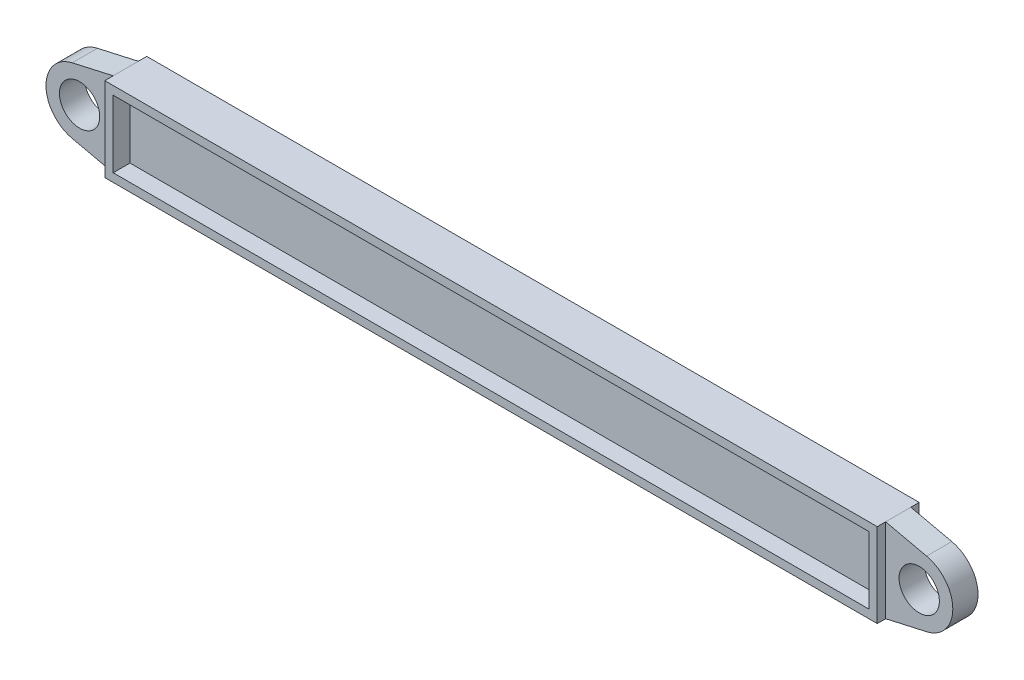
ISO-10303-21;
HEADER;
FILE_DESCRIPTION(('STEP AP214'),'2;1');
FILE_NAME('part.step','',(''),(''),'','','');
FILE_SCHEMA(('AUTOMOTIVE_DESIGN { 1 0 10303 214 1 1 1 1 }'));
ENDSEC;
DATA;
#1=APPLICATION_CONTEXT('core data for automotive mechanical design processes');
#2=APPLICATION_PROTOCOL_DEFINITION('international standard','automotive_design',2000,#1);
#3=PRODUCT_CONTEXT('',#1,'mechanical');
#4=PRODUCT('Part','Part','',(#3));
#5=PRODUCT_RELATED_PRODUCT_CATEGORY('part','',(#4));
#6=PRODUCT_DEFINITION_FORMATION('','',#4);
#7=PRODUCT_DEFINITION_CONTEXT('part definition',#1,'design');
#8=PRODUCT_DEFINITION('design','',#6,#7);
#9=PRODUCT_DEFINITION_SHAPE('','',#8);
#10=(LENGTH_UNIT() NAMED_UNIT(*) SI_UNIT(.MILLI.,.METRE.));
#11=(NAMED_UNIT(*) PLANE_ANGLE_UNIT() SI_UNIT($,.RADIAN.));
#12=(NAMED_UNIT(*) SI_UNIT($,.STERADIAN.) SOLID_ANGLE_UNIT());
#13=UNCERTAINTY_MEASURE_WITH_UNIT(LENGTH_MEASURE(1.E-05),#10,'distance_accuracy_value','');
#14=(GEOMETRIC_REPRESENTATION_CONTEXT(3) GLOBAL_UNCERTAINTY_ASSIGNED_CONTEXT((#13)) GLOBAL_UNIT_ASSIGNED_CONTEXT((#10,
#11,#12)) REPRESENTATION_CONTEXT('',''));
#15=CARTESIAN_POINT('',(0.,0.,0.));
#16=DIRECTION('',(0.,0.,1.));
#17=DIRECTION('',(1.,0.,0.));
#18=AXIS2_PLACEMENT_3D('',#15,#16,#17);
#19=CARTESIAN_POINT('',(479.999998864144,-4.99999495174681,25.));
#20=DIRECTION('',(-0.219511993191811,0.975609801531821,0.));
#21=DIRECTION('',(-0.975609801531821,-0.219511993191811,0.));
#22=AXIS2_PLACEMENT_3D('',#19,#20,#21);
#23=PLANE('',#22);
#24=DIRECTION('',(-0.975609801531821,-0.219511993191811,0.));
#25=VECTOR('',#24,1.);
#26=CARTESIAN_POINT('',(479.999998864144,-4.99999495174681,5.));
#27=LINE('',#26,#25);
#28=CARTESIAN_POINT('',(504.390239863836,0.487803969363591,5.));
#29=VERTEX_POINT('',#28);
#30=CARTESIAN_POINT('',(479.999998864144,-4.99999495174681,5.));
#31=VERTEX_POINT('',#30);
#32=EDGE_CURVE('E264',#29,#31,#27,.T.);
#33=ORIENTED_EDGE('',*,*,#32,.F.);
#34=DIRECTION('',(0.,0.,-1.));
#35=VECTOR('',#34,1.);
#36=CARTESIAN_POINT('',(504.390239863836,0.487803969363591,25.));
#37=LINE('',#36,#35);
#38=CARTESIAN_POINT('',(504.390239863836,0.487803969363591,20.));
#39=VERTEX_POINT('',#38);
#40=EDGE_CURVE('E320',#39,#29,#37,.T.);
#41=ORIENTED_EDGE('',*,*,#40,.F.);
#42=DIRECTION('',(0.975609801531821,0.219511993191811,0.));
#43=VECTOR('',#42,1.);
#44=CARTESIAN_POINT('',(479.999998864144,-4.99999495174681,20.));
#45=LINE('',#44,#43);
#46=CARTESIAN_POINT('',(479.999998864144,-4.99999495174681,20.));
#47=VERTEX_POINT('',#46);
#48=EDGE_CURVE('E289',#47,#39,#45,.T.);
#49=ORIENTED_EDGE('',*,*,#48,.F.);
#50=DIRECTION('',(0.,0.,-1.));
#51=VECTOR('',#50,1.);
#52=CARTESIAN_POINT('',(479.999998864144,-4.99999495174681,25.));
#53=LINE('',#52,#51);
#54=EDGE_CURVE('E323',#47,#31,#53,.T.);
#55=ORIENTED_EDGE('',*,*,#54,.T.);
#56=EDGE_LOOP('',(#33,#41,#49,#55));
#57=FACE_BOUND('',#56,.T.);
#58=ADVANCED_FACE('F33',(#57),#23,.F.);
#59=CARTESIAN_POINT('',(500.,20.,25.));
#60=DIRECTION('',(0.,0.,-1.));
#61=DIRECTION('',(-1.,0.,0.));
#62=AXIS2_PLACEMENT_3D('',#59,#60,#61);
#63=CYLINDRICAL_SURFACE('',#62,20.);
#64=CARTESIAN_POINT('',(500.,20.,5.));
#65=DIRECTION('',(0.,0.,-1.));
#66=DIRECTION('',(-1.,0.,0.));
#67=AXIS2_PLACEMENT_3D('',#64,#65,#66);
#68=CIRCLE('',#67,20.);
#69=CARTESIAN_POINT('',(504.390239863836,39.5121960306364,5.));
#70=VERTEX_POINT('',#69);
#71=EDGE_CURVE('E262',#70,#29,#68,.T.);
#72=ORIENTED_EDGE('',*,*,#71,.F.);
#73=DIRECTION('',(0.,0.,-1.));
#74=VECTOR('',#73,1.);
#75=CARTESIAN_POINT('',(504.390239863836,39.5121960306364,25.));
#76=LINE('',#75,#74);
#77=CARTESIAN_POINT('',(504.390239863836,39.5121960306364,20.));
#78=VERTEX_POINT('',#77);
#79=EDGE_CURVE('E317',#78,#70,#76,.T.);
#80=ORIENTED_EDGE('',*,*,#79,.F.);
#81=CARTESIAN_POINT('',(500.,20.,20.));
#82=DIRECTION('',(0.,0.,1.));
#83=DIRECTION('',(1.,0.,0.));
#84=AXIS2_PLACEMENT_3D('',#81,#82,#83);
#85=CIRCLE('',#84,20.);
#86=EDGE_CURVE('E290',#39,#78,#85,.T.);
#87=ORIENTED_EDGE('',*,*,#86,.F.);
#88=ORIENTED_EDGE('',*,*,#40,.T.);
#89=EDGE_LOOP('',(#72,#80,#87,#88));
#90=FACE_BOUND('',#89,.T.);
#91=ADVANCED_FACE('F371',(#90),#63,.T.);
#92=CARTESIAN_POINT('',(479.999998864144,44.9999949517468,25.));
#93=DIRECTION('',(-0.219511993191811,-0.975609801531821,0.));
#94=DIRECTION('',(0.975609801531821,-0.219511993191811,0.));
#95=AXIS2_PLACEMENT_3D('',#92,#93,#94);
#96=PLANE('',#95);
#97=DIRECTION('',(0.975609801531821,-0.219511993191811,0.));
#98=VECTOR('',#97,1.);
#99=CARTESIAN_POINT('',(479.999998864144,44.9999949517468,5.));
#100=LINE('',#99,#98);
#101=CARTESIAN_POINT('',(479.999998864144,44.9999949517468,5.));
#102=VERTEX_POINT('',#101);
#103=EDGE_CURVE('E260',#102,#70,#100,.T.);
#104=ORIENTED_EDGE('',*,*,#103,.F.);
#105=DIRECTION('',(0.,0.,-1.));
#106=VECTOR('',#105,1.);
#107=CARTESIAN_POINT('',(479.999998864144,44.9999949517468,25.));
#108=LINE('',#107,#106);
#109=CARTESIAN_POINT('',(479.999998864144,44.9999949517468,20.));
#110=VERTEX_POINT('',#109);
#111=EDGE_CURVE('E307',#110,#102,#108,.T.);
#112=ORIENTED_EDGE('',*,*,#111,.F.);
#113=DIRECTION('',(-0.975609801531821,0.219511993191811,0.));
#114=VECTOR('',#113,1.);
#115=CARTESIAN_POINT('',(504.390239863836,39.5121960306364,20.));
#116=LINE('',#115,#114);
#117=EDGE_CURVE('E292',#78,#110,#116,.T.);
#118=ORIENTED_EDGE('',*,*,#117,.F.);
#119=ORIENTED_EDGE('',*,*,#79,.T.);
#120=EDGE_LOOP('',(#104,#112,#118,#119));
#121=FACE_BOUND('',#120,.T.);
#122=ADVANCED_FACE('F373',(#121),#96,.F.);
#123=CARTESIAN_POINT('',(500.,20.,25.));
#124=DIRECTION('',(0.,0.,-1.));
#125=DIRECTION('',(-1.,0.,0.));
#126=AXIS2_PLACEMENT_3D('',#123,#124,#125);
#127=CYLINDRICAL_SURFACE('',#126,12.);
#128=CARTESIAN_POINT('',(500.,20.,20.));
#129=DIRECTION('',(0.,0.,1.));
#130=DIRECTION('',(1.,0.,0.));
#131=AXIS2_PLACEMENT_3D('',#128,#129,#130);
#132=CIRCLE('',#131,12.);
#133=CARTESIAN_POINT('',(512.,20.,20.));
#134=VERTEX_POINT('',#133);
#135=EDGE_CURVE('E287',#134,#134,#132,.T.);
#136=ORIENTED_EDGE('',*,*,#135,.T.);
#137=EDGE_LOOP('',(#136));
#138=FACE_BOUND('',#137,.T.);
#139=CARTESIAN_POINT('',(500.,20.,5.));
#140=DIRECTION('',(0.,0.,-1.));
#141=DIRECTION('',(-1.,0.,0.));
#142=AXIS2_PLACEMENT_3D('',#139,#140,#141);
#143=CIRCLE('',#142,12.);
#144=CARTESIAN_POINT('',(488.,20.,5.));
#145=VERTEX_POINT('',#144);
#146=EDGE_CURVE('E259',#145,#145,#143,.T.);
#147=ORIENTED_EDGE('',*,*,#146,.T.);
#148=EDGE_LOOP('',(#147));
#149=FACE_BOUND('',#148,.T.);
#150=ADVANCED_FACE('F342',(#138,#149),#127,.F.);
#151=CARTESIAN_POINT('',(20.0000011358559,44.9999949517468,25.));
#152=DIRECTION('',(0.219511993191812,-0.975609801531821,0.));
#153=DIRECTION('',(0.975609801531821,0.219511993191812,0.));
#154=AXIS2_PLACEMENT_3D('',#151,#152,#153);
#155=PLANE('',#154);
#156=DIRECTION('',(0.,0.,-1.));
#157=VECTOR('',#156,1.);
#158=CARTESIAN_POINT('',(20.0000011358559,44.9999949517468,25.));
#159=LINE('',#158,#157);
#160=CARTESIAN_POINT('',(20.0000011358559,44.9999949517468,20.));
#161=VERTEX_POINT('',#160);
#162=CARTESIAN_POINT('',(20.0000011358559,44.9999949517468,5.));
#163=VERTEX_POINT('',#162);
#164=EDGE_CURVE('E42',#161,#163,#159,.T.);
#165=ORIENTED_EDGE('',*,*,#164,.T.);
#166=DIRECTION('',(-0.975609801531821,-0.219511993191812,0.));
#167=VECTOR('',#166,1.);
#168=CARTESIAN_POINT('',(20.0000011358559,44.9999949517468,5.));
#169=LINE('',#168,#167);
#170=CARTESIAN_POINT('',(-4.39023986383623,39.5121960306364,5.));
#171=VERTEX_POINT('',#170);
#172=EDGE_CURVE('E273',#163,#171,#169,.T.);
#173=ORIENTED_EDGE('',*,*,#172,.T.);
#174=DIRECTION('',(0.,0.,-1.));
#175=VECTOR('',#174,1.);
#176=CARTESIAN_POINT('',(-4.39023986383623,39.5121960306364,25.));
#177=LINE('',#176,#175);
#178=CARTESIAN_POINT('',(-4.39023986383623,39.5121960306364,20.));
#179=VERTEX_POINT('',#178);
#180=EDGE_CURVE('E333',#179,#171,#177,.T.);
#181=ORIENTED_EDGE('',*,*,#180,.F.);
#182=DIRECTION('',(-0.975609801531821,-0.219511993191811,0.));
#183=VECTOR('',#182,1.);
#184=CARTESIAN_POINT('',(-4.39023986383623,39.5121960306364,20.));
#185=LINE('',#184,#183);
#186=EDGE_CURVE('E285',#161,#179,#185,.T.);
#187=ORIENTED_EDGE('',*,*,#186,.F.);
#188=EDGE_LOOP('',(#165,#173,#181,#187));
#189=FACE_BOUND('',#188,.T.);
#190=ADVANCED_FACE('F407',(#189),#155,.F.);
#191=CARTESIAN_POINT('',(0.,20.,25.));
#192=DIRECTION('',(0.,0.,-1.));
#193=DIRECTION('',(-1.,0.,0.));
#194=AXIS2_PLACEMENT_3D('',#191,#192,#193);
#195=CYLINDRICAL_SURFACE('',#194,20.);
#196=ORIENTED_EDGE('',*,*,#180,.T.);
#197=CARTESIAN_POINT('',(0.,20.,5.));
#198=DIRECTION('',(0.,0.,1.));
#199=DIRECTION('',(1.,0.,0.));
#200=AXIS2_PLACEMENT_3D('',#197,#198,#199);
#201=CIRCLE('',#200,20.);
#202=CARTESIAN_POINT('',(-4.39023986383622,0.48780396936359,5.));
#203=VERTEX_POINT('',#202);
#204=EDGE_CURVE('E270',#171,#203,#201,.T.);
#205=ORIENTED_EDGE('',*,*,#204,.T.);
#206=DIRECTION('',(0.,0.,-1.));
#207=VECTOR('',#206,1.);
#208=CARTESIAN_POINT('',(-4.39023986383623,0.487803969363591,25.));
#209=LINE('',#208,#207);
#210=CARTESIAN_POINT('',(-4.39023986383623,0.487803969363591,20.));
#211=VERTEX_POINT('',#210);
#212=EDGE_CURVE('E330',#211,#203,#209,.T.);
#213=ORIENTED_EDGE('',*,*,#212,.F.);
#214=CARTESIAN_POINT('',(0.,20.,20.));
#215=DIRECTION('',(0.,0.,1.));
#216=DIRECTION('',(1.,0.,0.));
#217=AXIS2_PLACEMENT_3D('',#214,#215,#216);
#218=CIRCLE('',#217,20.);
#219=EDGE_CURVE('E277',#179,#211,#218,.T.);
#220=ORIENTED_EDGE('',*,*,#219,.F.);
#221=EDGE_LOOP('',(#196,#205,#213,#220));
#222=FACE_BOUND('',#221,.T.);
#223=ADVANCED_FACE('F402',(#222),#195,.T.);
#224=CARTESIAN_POINT('',(20.0000011358559,-4.99999495174681,25.));
#225=DIRECTION('',(0.219511993191812,0.975609801531821,0.));
#226=DIRECTION('',(-0.975609801531821,0.219511993191812,0.));
#227=AXIS2_PLACEMENT_3D('',#224,#225,#226);
#228=PLANE('',#227);
#229=ORIENTED_EDGE('',*,*,#212,.T.);
#230=DIRECTION('',(0.975609801531821,-0.219511993191812,0.));
#231=VECTOR('',#230,1.);
#232=CARTESIAN_POINT('',(20.0000011358559,-4.99999495174681,5.));
#233=LINE('',#232,#231);
#234=CARTESIAN_POINT('',(20.0000011358559,-4.99999495174681,5.));
#235=VERTEX_POINT('',#234);
#236=EDGE_CURVE('E267',#203,#235,#233,.T.);
#237=ORIENTED_EDGE('',*,*,#236,.T.);
#238=DIRECTION('',(0.,0.,-1.));
#239=VECTOR('',#238,1.);
#240=CARTESIAN_POINT('',(20.0000011358559,-4.99999495174681,25.));
#241=LINE('',#240,#239);
#242=CARTESIAN_POINT('',(20.0000011358559,-4.99999495174681,20.));
#243=VERTEX_POINT('',#242);
#244=EDGE_CURVE('E326',#243,#235,#241,.T.);
#245=ORIENTED_EDGE('',*,*,#244,.F.);
#246=DIRECTION('',(0.975609801531821,-0.219511993191811,0.));
#247=VECTOR('',#246,1.);
#248=CARTESIAN_POINT('',(20.0000011358559,-4.99999495174681,20.));
#249=LINE('',#248,#247);
#250=EDGE_CURVE('E279',#211,#243,#249,.T.);
#251=ORIENTED_EDGE('',*,*,#250,.F.);
#252=EDGE_LOOP('',(#229,#237,#245,#251));
#253=FACE_BOUND('',#252,.T.);
#254=ADVANCED_FACE('F395',(#253),#228,.F.);
#255=CARTESIAN_POINT('',(0.,20.,25.));
#256=DIRECTION('',(0.,0.,-1.));
#257=DIRECTION('',(-1.,0.,0.));
#258=AXIS2_PLACEMENT_3D('',#255,#256,#257);
#259=CYLINDRICAL_SURFACE('',#258,12.);
#260=CARTESIAN_POINT('',(0.,20.,5.));
#261=DIRECTION('',(0.,0.,1.));
#262=DIRECTION('',(1.,0.,0.));
#263=AXIS2_PLACEMENT_3D('',#260,#261,#262);
#264=CIRCLE('',#263,12.);
#265=CARTESIAN_POINT('',(12.,20.,5.));
#266=VERTEX_POINT('',#265);
#267=EDGE_CURVE('E37',#266,#266,#264,.T.);
#268=ORIENTED_EDGE('',*,*,#267,.F.);
#269=EDGE_LOOP('',(#268));
#270=FACE_BOUND('',#269,.T.);
#271=CARTESIAN_POINT('',(0.,20.,20.));
#272=DIRECTION('',(0.,0.,1.));
#273=DIRECTION('',(1.,0.,0.));
#274=AXIS2_PLACEMENT_3D('',#271,#272,#273);
#275=CIRCLE('',#274,12.);
#276=CARTESIAN_POINT('',(12.,20.,20.));
#277=VERTEX_POINT('',#276);
#278=EDGE_CURVE('E311',#277,#277,#275,.T.);
#279=ORIENTED_EDGE('',*,*,#278,.T.);
#280=EDGE_LOOP('',(#279));
#281=FACE_BOUND('',#280,.T.);
#282=ADVANCED_FACE('F435',(#270,#281),#259,.F.);
#283=CARTESIAN_POINT('',(500.,20.,25.));
#284=DIRECTION('',(0.,0.,-1.));
#285=DIRECTION('',(-1.,0.,0.));
#286=AXIS2_PLACEMENT_3D('',#283,#284,#285);
#287=PLANE('',#286);
#288=DIRECTION('',(1.,0.,0.));
#289=VECTOR('',#288,1.);
#290=CARTESIAN_POINT('',(25.0000011358559,5.04825319394553E-06,25.));
#291=LINE('',#290,#289);
#292=CARTESIAN_POINT('',(25.0000011358558,5.04825319394553E-06,25.));
#293=VERTEX_POINT('',#292);
#294=CARTESIAN_POINT('',(475.000001135856,5.04825319394553E-06,25.));
#295=VERTEX_POINT('',#294);
#296=EDGE_CURVE('E200',#293,#295,#291,.T.);
#297=ORIENTED_EDGE('',*,*,#296,.F.);
#298=DIRECTION('',(0.,-1.,0.));
#299=VECTOR('',#298,1.);
#300=CARTESIAN_POINT('',(25.0000011358559,40.0000050482532,25.));
#301=LINE('',#300,#299);
#302=CARTESIAN_POINT('',(25.0000011358559,40.0000050482532,25.));
#303=VERTEX_POINT('',#302);
#304=EDGE_CURVE('E50',#303,#293,#301,.T.);
#305=ORIENTED_EDGE('',*,*,#304,.F.);
#306=DIRECTION('',(-1.,0.,0.));
#307=VECTOR('',#306,1.);
#308=CARTESIAN_POINT('',(25.0000011358559,40.0000050482532,25.));
#309=LINE('',#308,#307);
#310=CARTESIAN_POINT('',(475.000001135856,40.0000050482532,25.));
#311=VERTEX_POINT('',#310);
#312=EDGE_CURVE('E191',#311,#303,#309,.T.);
#313=ORIENTED_EDGE('',*,*,#312,.F.);
#314=DIRECTION('',(0.,1.,0.));
#315=VECTOR('',#314,1.);
#316=CARTESIAN_POINT('',(475.000001135856,40.0000050482532,25.));
#317=LINE('',#316,#315);
#318=EDGE_CURVE('E194',#295,#311,#317,.T.);
#319=ORIENTED_EDGE('',*,*,#318,.F.);
#320=EDGE_LOOP('',(#297,#305,#313,#319));
#321=FACE_BOUND('',#320,.T.);
#322=DIRECTION('',(-1.,0.,0.));
#323=VECTOR('',#322,1.);
#324=CARTESIAN_POINT('',(20.0000011358559,44.9999949517468,25.));
#325=LINE('',#324,#323);
#326=CARTESIAN_POINT('',(479.999998864144,44.9999949517468,25.));
#327=VERTEX_POINT('',#326);
#328=CARTESIAN_POINT('',(20.0000011358559,44.9999949517468,25.));
#329=VERTEX_POINT('',#328);
#330=EDGE_CURVE('E300',#327,#329,#325,.T.);
#331=ORIENTED_EDGE('',*,*,#330,.T.);
#332=DIRECTION('',(0.,1.,0.));
#333=VECTOR('',#332,1.);
#334=CARTESIAN_POINT('',(20.0000011358559,44.9999949517468,25.));
#335=LINE('',#334,#333);
#336=CARTESIAN_POINT('',(20.0000011358559,-4.99999495174681,25.));
#337=VERTEX_POINT('',#336);
#338=EDGE_CURVE('E280',#337,#329,#335,.T.);
#339=ORIENTED_EDGE('',*,*,#338,.F.);
#340=DIRECTION('',(1.,0.,0.));
#341=VECTOR('',#340,1.);
#342=CARTESIAN_POINT('',(20.0000011358559,-4.99999495174681,25.));
#343=LINE('',#342,#341);
#344=CARTESIAN_POINT('',(479.999998864144,-4.99999495174681,25.));
#345=VERTEX_POINT('',#344);
#346=EDGE_CURVE('E303',#337,#345,#343,.T.);
#347=ORIENTED_EDGE('',*,*,#346,.T.);
#348=DIRECTION('',(0.,-1.,0.));
#349=VECTOR('',#348,1.);
#350=CARTESIAN_POINT('',(479.999998864144,44.9999949517468,25.));
#351=LINE('',#350,#349);
#352=EDGE_CURVE('E276',#327,#345,#351,.T.);
#353=ORIENTED_EDGE('',*,*,#352,.F.);
#354=EDGE_LOOP('',(#331,#339,#347,#353));
#355=FACE_BOUND('',#354,.T.);
#356=ADVANCED_FACE('F383',(#321,#355),#287,.F.);
#357=CARTESIAN_POINT('',(500.,20.,0.));
#358=DIRECTION('',(0.,0.,-1.));
#359=DIRECTION('',(-1.,0.,0.));
#360=AXIS2_PLACEMENT_3D('',#357,#358,#359);
#361=PLANE('',#360);
#362=DIRECTION('',(0.,-1.,0.));
#363=VECTOR('',#362,1.);
#364=CARTESIAN_POINT('',(475.000001135856,39.9999949517468,0.));
#365=LINE('',#364,#363);
#366=CARTESIAN_POINT('',(475.000001135856,39.9999949517468,0.));
#367=VERTEX_POINT('',#366);
#368=CARTESIAN_POINT('',(475.000001135856,-5.04825319047608E-06,0.));
#369=VERTEX_POINT('',#368);
#370=EDGE_CURVE('E58',#367,#369,#365,.T.);
#371=ORIENTED_EDGE('',*,*,#370,.F.);
#372=DIRECTION('',(1.,0.,0.));
#373=VECTOR('',#372,1.);
#374=CARTESIAN_POINT('',(475.000001135856,39.9999949517468,0.));
#375=LINE('',#374,#373);
#376=CARTESIAN_POINT('',(25.0000011358559,39.9999949517468,0.));
#377=VERTEX_POINT('',#376);
#378=EDGE_CURVE('E213',#377,#367,#375,.T.);
#379=ORIENTED_EDGE('',*,*,#378,.F.);
#380=DIRECTION('',(0.,1.,0.));
#381=VECTOR('',#380,1.);
#382=CARTESIAN_POINT('',(25.0000011358559,39.9999949517468,0.));
#383=LINE('',#382,#381);
#384=CARTESIAN_POINT('',(25.0000011358559,-5.04825319047608E-06,0.));
#385=VERTEX_POINT('',#384);
#386=EDGE_CURVE('E227',#385,#377,#383,.T.);
#387=ORIENTED_EDGE('',*,*,#386,.F.);
#388=DIRECTION('',(-1.,0.,0.));
#389=VECTOR('',#388,1.);
#390=CARTESIAN_POINT('',(475.000001135856,-5.04825319047608E-06,0.));
#391=LINE('',#390,#389);
#392=EDGE_CURVE('E224',#369,#385,#391,.T.);
#393=ORIENTED_EDGE('',*,*,#392,.F.);
#394=EDGE_LOOP('',(#371,#379,#387,#393));
#395=FACE_BOUND('',#394,.T.);
#396=DIRECTION('',(0.,1.,0.));
#397=VECTOR('',#396,1.);
#398=CARTESIAN_POINT('',(479.999998864144,-4.99999495174681,0.));
#399=LINE('',#398,#397);
#400=CARTESIAN_POINT('',(479.999998864144,-4.99999495174681,0.));
#401=VERTEX_POINT('',#400);
#402=CARTESIAN_POINT('',(479.999998864144,44.9999949517468,0.));
#403=VERTEX_POINT('',#402);
#404=EDGE_CURVE('E244',#401,#403,#399,.T.);
#405=ORIENTED_EDGE('',*,*,#404,.F.);
#406=DIRECTION('',(1.,0.,0.));
#407=VECTOR('',#406,1.);
#408=CARTESIAN_POINT('',(20.0000011358559,-4.99999495174681,0.));
#409=LINE('',#408,#407);
#410=CARTESIAN_POINT('',(20.0000011358559,-4.99999495174681,0.));
#411=VERTEX_POINT('',#410);
#412=EDGE_CURVE('E304',#411,#401,#409,.T.);
#413=ORIENTED_EDGE('',*,*,#412,.F.);
#414=DIRECTION('',(0.,-1.,0.));
#415=VECTOR('',#414,1.);
#416=CARTESIAN_POINT('',(20.0000011358559,-4.99999495174681,0.));
#417=LINE('',#416,#415);
#418=CARTESIAN_POINT('',(20.0000011358559,44.9999949517468,0.));
#419=VERTEX_POINT('',#418);
#420=EDGE_CURVE('E234',#419,#411,#417,.T.);
#421=ORIENTED_EDGE('',*,*,#420,.F.);
#422=DIRECTION('',(-1.,0.,0.));
#423=VECTOR('',#422,1.);
#424=CARTESIAN_POINT('',(20.0000011358559,44.9999949517468,0.));
#425=LINE('',#424,#423);
#426=EDGE_CURVE('E308',#403,#419,#425,.T.);
#427=ORIENTED_EDGE('',*,*,#426,.F.);
#428=EDGE_LOOP('',(#405,#413,#421,#427));
#429=FACE_BOUND('',#428,.T.);
#430=ADVANCED_FACE('F413',(#395,#429),#361,.T.);
#431=CARTESIAN_POINT('',(20.0000011358559,44.9999949517468,25.));
#432=DIRECTION('',(0.,-1.,0.));
#433=DIRECTION('',(0.,0.,-1.));
#434=AXIS2_PLACEMENT_3D('',#431,#432,#433);
#435=PLANE('',#434);
#436=ORIENTED_EDGE('',*,*,#426,.T.);
#437=DIRECTION('',(0.,0.,1.));
#438=VECTOR('',#437,1.);
#439=CARTESIAN_POINT('',(20.0000011358559,44.9999949517468,25.));
#440=LINE('',#439,#438);
#441=EDGE_CURVE('E248',#419,#163,#440,.T.);
#442=ORIENTED_EDGE('',*,*,#441,.T.);
#443=ORIENTED_EDGE('',*,*,#164,.F.);
#444=EDGE_CURVE('E11',#329,#161,#159,.T.);
#445=ORIENTED_EDGE('',*,*,#444,.F.);
#446=ORIENTED_EDGE('',*,*,#330,.F.);
#447=EDGE_CURVE('E314',#327,#110,#108,.T.);
#448=ORIENTED_EDGE('',*,*,#447,.T.);
#449=ORIENTED_EDGE('',*,*,#111,.T.);
#450=DIRECTION('',(0.,0.,-1.));
#451=VECTOR('',#450,1.);
#452=CARTESIAN_POINT('',(479.999998864144,44.9999949517468,25.));
#453=LINE('',#452,#451);
#454=EDGE_CURVE('E256',#102,#403,#453,.T.);
#455=ORIENTED_EDGE('',*,*,#454,.T.);
#456=EDGE_LOOP('',(#436,#442,#443,#445,#446,#448,#449,#455));
#457=FACE_BOUND('',#456,.T.);
#458=ADVANCED_FACE('F35',(#457),#435,.F.);
#459=CARTESIAN_POINT('',(20.0000011358559,-4.99999495174681,25.));
#460=DIRECTION('',(0.,1.,0.));
#461=DIRECTION('',(0.,0.,1.));
#462=AXIS2_PLACEMENT_3D('',#459,#460,#461);
#463=PLANE('',#462);
#464=ORIENTED_EDGE('',*,*,#412,.T.);
#465=DIRECTION('',(0.,0.,-1.));
#466=VECTOR('',#465,1.);
#467=CARTESIAN_POINT('',(479.999998864144,-4.99999495174681,5.));
#468=LINE('',#467,#466);
#469=EDGE_CURVE('E243',#31,#401,#468,.T.);
#470=ORIENTED_EDGE('',*,*,#469,.F.);
#471=ORIENTED_EDGE('',*,*,#54,.F.);
#472=EDGE_CURVE('E324',#345,#47,#53,.T.);
#473=ORIENTED_EDGE('',*,*,#472,.F.);
#474=ORIENTED_EDGE('',*,*,#346,.F.);
#475=EDGE_CURVE('E327',#337,#243,#241,.T.);
#476=ORIENTED_EDGE('',*,*,#475,.T.);
#477=ORIENTED_EDGE('',*,*,#244,.T.);
#478=DIRECTION('',(0.,0.,-1.));
#479=VECTOR('',#478,1.);
#480=CARTESIAN_POINT('',(20.0000011358559,-4.99999495174681,5.));
#481=LINE('',#480,#479);
#482=EDGE_CURVE('E246',#235,#411,#481,.T.);
#483=ORIENTED_EDGE('',*,*,#482,.T.);
#484=EDGE_LOOP('',(#464,#470,#471,#473,#474,#476,#477,#483));
#485=FACE_BOUND('',#484,.T.);
#486=ADVANCED_FACE('F359',(#485),#463,.F.);
#487=CARTESIAN_POINT('',(479.999998864144,44.9999949517468,20.));
#488=DIRECTION('',(-1.,0.,0.));
#489=DIRECTION('',(0.,0.,1.));
#490=AXIS2_PLACEMENT_3D('',#487,#488,#489);
#491=PLANE('',#490);
#492=ORIENTED_EDGE('',*,*,#352,.T.);
#493=ORIENTED_EDGE('',*,*,#472,.T.);
#494=DIRECTION('',(0.,-1.,0.));
#495=VECTOR('',#494,1.);
#496=CARTESIAN_POINT('',(479.999998864144,44.9999949517468,20.));
#497=LINE('',#496,#495);
#498=EDGE_CURVE('E295',#110,#47,#497,.T.);
#499=ORIENTED_EDGE('',*,*,#498,.F.);
#500=ORIENTED_EDGE('',*,*,#447,.F.);
#501=EDGE_LOOP('',(#492,#493,#499,#500));
#502=FACE_BOUND('',#501,.T.);
#503=ADVANCED_FACE('F381',(#502),#491,.F.);
#504=CARTESIAN_POINT('',(500.,20.,20.));
#505=DIRECTION('',(0.,0.,1.));
#506=DIRECTION('',(1.,0.,0.));
#507=AXIS2_PLACEMENT_3D('',#504,#505,#506);
#508=PLANE('',#507);
#509=ORIENTED_EDGE('',*,*,#135,.F.);
#510=EDGE_LOOP('',(#509));
#511=FACE_BOUND('',#510,.T.);
#512=ORIENTED_EDGE('',*,*,#86,.T.);
#513=ORIENTED_EDGE('',*,*,#117,.T.);
#514=ORIENTED_EDGE('',*,*,#498,.T.);
#515=ORIENTED_EDGE('',*,*,#48,.T.);
#516=EDGE_LOOP('',(#512,#513,#514,#515));
#517=FACE_BOUND('',#516,.T.);
#518=ADVANCED_FACE('F367',(#511,#517),#508,.T.);
#519=CARTESIAN_POINT('',(20.0000011358559,44.9999949517468,20.));
#520=DIRECTION('',(1.,0.,0.));
#521=DIRECTION('',(0.,0.,-1.));
#522=AXIS2_PLACEMENT_3D('',#519,#520,#521);
#523=PLANE('',#522);
#524=ORIENTED_EDGE('',*,*,#338,.T.);
#525=ORIENTED_EDGE('',*,*,#444,.T.);
#526=DIRECTION('',(0.,1.,0.));
#527=VECTOR('',#526,1.);
#528=CARTESIAN_POINT('',(20.0000011358559,44.9999949517468,20.));
#529=LINE('',#528,#527);
#530=EDGE_CURVE('E282',#243,#161,#529,.T.);
#531=ORIENTED_EDGE('',*,*,#530,.F.);
#532=ORIENTED_EDGE('',*,*,#475,.F.);
#533=EDGE_LOOP('',(#524,#525,#531,#532));
#534=FACE_BOUND('',#533,.T.);
#535=ADVANCED_FACE('F390',(#534),#523,.F.);
#536=CARTESIAN_POINT('',(0.,20.,20.));
#537=DIRECTION('',(0.,0.,1.));
#538=DIRECTION('',(1.,0.,0.));
#539=AXIS2_PLACEMENT_3D('',#536,#537,#538);
#540=PLANE('',#539);
#541=ORIENTED_EDGE('',*,*,#278,.F.);
#542=EDGE_LOOP('',(#541));
#543=FACE_BOUND('',#542,.T.);
#544=ORIENTED_EDGE('',*,*,#219,.T.);
#545=ORIENTED_EDGE('',*,*,#250,.T.);
#546=ORIENTED_EDGE('',*,*,#530,.T.);
#547=ORIENTED_EDGE('',*,*,#186,.T.);
#548=EDGE_LOOP('',(#544,#545,#546,#547));
#549=FACE_BOUND('',#548,.T.);
#550=ADVANCED_FACE('F566',(#543,#549),#540,.T.);
#551=CARTESIAN_POINT('',(0.,0.,5.));
#552=DIRECTION('',(0.,0.,1.));
#553=DIRECTION('',(1.,0.,0.));
#554=AXIS2_PLACEMENT_3D('',#551,#552,#553);
#555=PLANE('',#554);
#556=ORIENTED_EDGE('',*,*,#267,.T.);
#557=EDGE_LOOP('',(#556));
#558=FACE_BOUND('',#557,.T.);
#559=DIRECTION('',(0.,-1.,0.));
#560=VECTOR('',#559,1.);
#561=CARTESIAN_POINT('',(20.0000011358559,-4.99999495174681,5.));
#562=LINE('',#561,#560);
#563=EDGE_CURVE('E249',#163,#235,#562,.T.);
#564=ORIENTED_EDGE('',*,*,#563,.T.);
#565=ORIENTED_EDGE('',*,*,#236,.F.);
#566=ORIENTED_EDGE('',*,*,#204,.F.);
#567=ORIENTED_EDGE('',*,*,#172,.F.);
#568=EDGE_LOOP('',(#564,#565,#566,#567));
#569=FACE_BOUND('',#568,.T.);
#570=ADVANCED_FACE('F398',(#558,#569),#555,.F.);
#571=CARTESIAN_POINT('',(20.0000011358559,-4.99999495174681,5.));
#572=DIRECTION('',(1.,0.,0.));
#573=DIRECTION('',(0.,0.,-1.));
#574=AXIS2_PLACEMENT_3D('',#571,#572,#573);
#575=PLANE('',#574);
#576=ORIENTED_EDGE('',*,*,#420,.T.);
#577=ORIENTED_EDGE('',*,*,#482,.F.);
#578=ORIENTED_EDGE('',*,*,#563,.F.);
#579=ORIENTED_EDGE('',*,*,#441,.F.);
#580=EDGE_LOOP('',(#576,#577,#578,#579));
#581=FACE_BOUND('',#580,.T.);
#582=ADVANCED_FACE('F348',(#581),#575,.F.);
#583=CARTESIAN_POINT('',(0.,0.,5.));
#584=DIRECTION('',(0.,0.,-1.));
#585=DIRECTION('',(-1.,0.,0.));
#586=AXIS2_PLACEMENT_3D('',#583,#584,#585);
#587=PLANE('',#586);
#588=ORIENTED_EDGE('',*,*,#146,.F.);
#589=EDGE_LOOP('',(#588));
#590=FACE_BOUND('',#589,.T.);
#591=ORIENTED_EDGE('',*,*,#32,.T.);
#592=DIRECTION('',(0.,1.,0.));
#593=VECTOR('',#592,1.);
#594=CARTESIAN_POINT('',(479.999998864144,-4.99999495174681,5.));
#595=LINE('',#594,#593);
#596=EDGE_CURVE('E240',#31,#102,#595,.T.);
#597=ORIENTED_EDGE('',*,*,#596,.T.);
#598=ORIENTED_EDGE('',*,*,#103,.T.);
#599=ORIENTED_EDGE('',*,*,#71,.T.);
#600=EDGE_LOOP('',(#591,#597,#598,#599));
#601=FACE_BOUND('',#600,.T.);
#602=ADVANCED_FACE('F344',(#590,#601),#587,.T.);
#603=CARTESIAN_POINT('',(479.999998864144,-4.99999495174681,5.));
#604=DIRECTION('',(-1.,0.,0.));
#605=DIRECTION('',(0.,0.,1.));
#606=AXIS2_PLACEMENT_3D('',#603,#604,#605);
#607=PLANE('',#606);
#608=ORIENTED_EDGE('',*,*,#596,.F.);
#609=ORIENTED_EDGE('',*,*,#469,.T.);
#610=ORIENTED_EDGE('',*,*,#404,.T.);
#611=ORIENTED_EDGE('',*,*,#454,.F.);
#612=EDGE_LOOP('',(#608,#609,#610,#611));
#613=FACE_BOUND('',#612,.T.);
#614=ADVANCED_FACE('F347',(#613),#607,.F.);
#615=CARTESIAN_POINT('',(475.000001135856,39.9999949517468,10.));
#616=DIRECTION('',(1.,0.,0.));
#617=DIRECTION('',(0.,0.,-1.));
#618=AXIS2_PLACEMENT_3D('',#615,#616,#617);
#619=PLANE('',#618);
#620=ORIENTED_EDGE('',*,*,#370,.T.);
#621=DIRECTION('',(0.,0.,-1.));
#622=VECTOR('',#621,1.);
#623=CARTESIAN_POINT('',(475.000001135856,-5.04825319047608E-06,10.));
#624=LINE('',#623,#622);
#625=CARTESIAN_POINT('',(475.000001135856,-5.04825319047608E-06,10.));
#626=VERTEX_POINT('',#625);
#627=EDGE_CURVE('E222',#626,#369,#624,.T.);
#628=ORIENTED_EDGE('',*,*,#627,.F.);
#629=DIRECTION('',(0.,-1.,0.));
#630=VECTOR('',#629,1.);
#631=CARTESIAN_POINT('',(475.000001135856,39.9999949517468,10.));
#632=LINE('',#631,#630);
#633=CARTESIAN_POINT('',(475.000001135856,39.9999949517468,10.));
#634=VERTEX_POINT('',#633);
#635=EDGE_CURVE('E209',#634,#626,#632,.T.);
#636=ORIENTED_EDGE('',*,*,#635,.F.);
#637=DIRECTION('',(0.,0.,-1.));
#638=VECTOR('',#637,1.);
#639=CARTESIAN_POINT('',(475.000001135856,39.9999949517468,10.));
#640=LINE('',#639,#638);
#641=EDGE_CURVE('E232',#634,#367,#640,.T.);
#642=ORIENTED_EDGE('',*,*,#641,.T.);
#643=EDGE_LOOP('',(#620,#628,#636,#642));
#644=FACE_BOUND('',#643,.T.);
#645=ADVANCED_FACE('F415',(#644),#619,.F.);
#646=CARTESIAN_POINT('',(475.000001135856,39.9999949517468,10.));
#647=DIRECTION('',(0.,1.,0.));
#648=DIRECTION('',(0.,0.,1.));
#649=AXIS2_PLACEMENT_3D('',#646,#647,#648);
#650=PLANE('',#649);
#651=ORIENTED_EDGE('',*,*,#378,.T.);
#652=ORIENTED_EDGE('',*,*,#641,.F.);
#653=DIRECTION('',(1.,0.,0.));
#654=VECTOR('',#653,1.);
#655=CARTESIAN_POINT('',(475.000001135856,39.9999949517468,10.));
#656=LINE('',#655,#654);
#657=CARTESIAN_POINT('',(25.0000011358559,39.9999949517468,10.));
#658=VERTEX_POINT('',#657);
#659=EDGE_CURVE('E219',#658,#634,#656,.T.);
#660=ORIENTED_EDGE('',*,*,#659,.F.);
#661=DIRECTION('',(0.,0.,-1.));
#662=VECTOR('',#661,1.);
#663=CARTESIAN_POINT('',(25.0000011358559,39.9999949517468,10.));
#664=LINE('',#663,#662);
#665=EDGE_CURVE('E235',#658,#377,#664,.T.);
#666=ORIENTED_EDGE('',*,*,#665,.T.);
#667=EDGE_LOOP('',(#651,#652,#660,#666));
#668=FACE_BOUND('',#667,.T.);
#669=ADVANCED_FACE('F420',(#668),#650,.F.);
#670=CARTESIAN_POINT('',(25.0000011358559,39.9999949517468,10.));
#671=DIRECTION('',(-1.,0.,0.));
#672=DIRECTION('',(0.,0.,1.));
#673=AXIS2_PLACEMENT_3D('',#670,#671,#672);
#674=PLANE('',#673);
#675=ORIENTED_EDGE('',*,*,#386,.T.);
#676=ORIENTED_EDGE('',*,*,#665,.F.);
#677=DIRECTION('',(0.,1.,0.));
#678=VECTOR('',#677,1.);
#679=CARTESIAN_POINT('',(25.0000011358559,39.9999949517468,10.));
#680=LINE('',#679,#678);
#681=CARTESIAN_POINT('',(25.0000011358559,-5.04825319047608E-06,10.));
#682=VERTEX_POINT('',#681);
#683=EDGE_CURVE('E216',#682,#658,#680,.T.);
#684=ORIENTED_EDGE('',*,*,#683,.F.);
#685=DIRECTION('',(0.,0.,-1.));
#686=VECTOR('',#685,1.);
#687=CARTESIAN_POINT('',(25.0000011358559,-5.04825319047608E-06,10.));
#688=LINE('',#687,#686);
#689=EDGE_CURVE('E237',#682,#385,#688,.T.);
#690=ORIENTED_EDGE('',*,*,#689,.T.);
#691=EDGE_LOOP('',(#675,#676,#684,#690));
#692=FACE_BOUND('',#691,.T.);
#693=ADVANCED_FACE('F474',(#692),#674,.F.);
#694=CARTESIAN_POINT('',(475.000001135856,-5.04825319047608E-06,10.));
#695=DIRECTION('',(0.,-1.,0.));
#696=DIRECTION('',(0.,0.,-1.));
#697=AXIS2_PLACEMENT_3D('',#694,#695,#696);
#698=PLANE('',#697);
#699=ORIENTED_EDGE('',*,*,#392,.T.);
#700=ORIENTED_EDGE('',*,*,#689,.F.);
#701=DIRECTION('',(-1.,0.,0.));
#702=VECTOR('',#701,1.);
#703=CARTESIAN_POINT('',(475.000001135856,-5.04825319047608E-06,10.));
#704=LINE('',#703,#702);
#705=EDGE_CURVE('E212',#626,#682,#704,.T.);
#706=ORIENTED_EDGE('',*,*,#705,.F.);
#707=ORIENTED_EDGE('',*,*,#627,.T.);
#708=EDGE_LOOP('',(#699,#700,#706,#707));
#709=FACE_BOUND('',#708,.T.);
#710=ADVANCED_FACE('F465',(#709),#698,.F.);
#711=CARTESIAN_POINT('',(0.,0.,10.));
#712=DIRECTION('',(0.,0.,-1.));
#713=DIRECTION('',(-1.,0.,0.));
#714=AXIS2_PLACEMENT_3D('',#711,#712,#713);
#715=PLANE('',#714);
#716=ORIENTED_EDGE('',*,*,#635,.T.);
#717=ORIENTED_EDGE('',*,*,#705,.T.);
#718=ORIENTED_EDGE('',*,*,#683,.T.);
#719=ORIENTED_EDGE('',*,*,#659,.T.);
#720=EDGE_LOOP('',(#716,#717,#718,#719));
#721=FACE_BOUND('',#720,.T.);
#722=ADVANCED_FACE('F471',(#721),#715,.T.);
#723=CARTESIAN_POINT('',(25.0000011358559,40.0000050482532,15.));
#724=DIRECTION('',(-1.,0.,0.));
#725=DIRECTION('',(0.,0.,1.));
#726=AXIS2_PLACEMENT_3D('',#723,#724,#725);
#727=PLANE('',#726);
#728=ORIENTED_EDGE('',*,*,#304,.T.);
#729=DIRECTION('',(0.,0.,1.));
#730=VECTOR('',#729,1.);
#731=CARTESIAN_POINT('',(25.0000011358559,5.04825319394553E-06,15.));
#732=LINE('',#731,#730);
#733=CARTESIAN_POINT('',(25.0000011358559,5.04825319394553E-06,15.));
#734=VERTEX_POINT('',#733);
#735=EDGE_CURVE('E169',#734,#293,#732,.T.);
#736=ORIENTED_EDGE('',*,*,#735,.F.);
#737=DIRECTION('',(0.,-1.,0.));
#738=VECTOR('',#737,1.);
#739=CARTESIAN_POINT('',(25.0000011358559,40.0000050482532,15.));
#740=LINE('',#739,#738);
#741=CARTESIAN_POINT('',(25.0000011358559,40.0000050482532,15.));
#742=VERTEX_POINT('',#741);
#743=EDGE_CURVE('E173',#742,#734,#740,.T.);
#744=ORIENTED_EDGE('',*,*,#743,.F.);
#745=DIRECTION('',(0.,0.,1.));
#746=VECTOR('',#745,1.);
#747=CARTESIAN_POINT('',(25.0000011358559,40.0000050482532,15.));
#748=LINE('',#747,#746);
#749=EDGE_CURVE('E204',#742,#303,#748,.T.);
#750=ORIENTED_EDGE('',*,*,#749,.T.);
#751=EDGE_LOOP('',(#728,#736,#744,#750));
#752=FACE_BOUND('',#751,.T.);
#753=ADVANCED_FACE('F171',(#752),#727,.F.);
#754=CARTESIAN_POINT('',(25.0000011358559,40.0000050482532,15.));
#755=DIRECTION('',(0.,1.,0.));
#756=DIRECTION('',(0.,0.,1.));
#757=AXIS2_PLACEMENT_3D('',#754,#755,#756);
#758=PLANE('',#757);
#759=ORIENTED_EDGE('',*,*,#312,.T.);
#760=ORIENTED_EDGE('',*,*,#749,.F.);
#761=DIRECTION('',(-1.,0.,0.));
#762=VECTOR('',#761,1.);
#763=CARTESIAN_POINT('',(25.0000011358559,40.0000050482532,15.));
#764=LINE('',#763,#762);
#765=CARTESIAN_POINT('',(475.000001135856,40.0000050482532,15.));
#766=VERTEX_POINT('',#765);
#767=EDGE_CURVE('E179',#766,#742,#764,.T.);
#768=ORIENTED_EDGE('',*,*,#767,.F.);
#769=DIRECTION('',(0.,0.,1.));
#770=VECTOR('',#769,1.);
#771=CARTESIAN_POINT('',(475.000001135856,40.0000050482532,15.));
#772=LINE('',#771,#770);
#773=EDGE_CURVE('E206',#766,#311,#772,.T.);
#774=ORIENTED_EDGE('',*,*,#773,.T.);
#775=EDGE_LOOP('',(#759,#760,#768,#774));
#776=FACE_BOUND('',#775,.T.);
#777=ADVANCED_FACE('F488',(#776),#758,.F.);
#778=CARTESIAN_POINT('',(475.000001135856,40.0000050482532,15.));
#779=DIRECTION('',(1.,0.,0.));
#780=DIRECTION('',(0.,0.,-1.));
#781=AXIS2_PLACEMENT_3D('',#778,#779,#780);
#782=PLANE('',#781);
#783=ORIENTED_EDGE('',*,*,#318,.T.);
#784=ORIENTED_EDGE('',*,*,#773,.F.);
#785=DIRECTION('',(0.,1.,0.));
#786=VECTOR('',#785,1.);
#787=CARTESIAN_POINT('',(475.000001135856,40.0000050482532,15.));
#788=LINE('',#787,#786);
#789=CARTESIAN_POINT('',(475.000001135856,5.04825319394553E-06,15.));
#790=VERTEX_POINT('',#789);
#791=EDGE_CURVE('E187',#790,#766,#788,.T.);
#792=ORIENTED_EDGE('',*,*,#791,.F.);
#793=DIRECTION('',(0.,0.,1.));
#794=VECTOR('',#793,1.);
#795=CARTESIAN_POINT('',(475.000001135856,5.04825319394553E-06,15.));
#796=LINE('',#795,#794);
#797=EDGE_CURVE('E178',#790,#295,#796,.T.);
#798=ORIENTED_EDGE('',*,*,#797,.T.);
#799=EDGE_LOOP('',(#783,#784,#792,#798));
#800=FACE_BOUND('',#799,.T.);
#801=ADVANCED_FACE('F491',(#800),#782,.F.);
#802=CARTESIAN_POINT('',(25.0000011358559,5.04825319394553E-06,15.));
#803=DIRECTION('',(0.,-1.,0.));
#804=DIRECTION('',(0.,0.,-1.));
#805=AXIS2_PLACEMENT_3D('',#802,#803,#804);
#806=PLANE('',#805);
#807=ORIENTED_EDGE('',*,*,#296,.T.);
#808=ORIENTED_EDGE('',*,*,#797,.F.);
#809=DIRECTION('',(1.,0.,0.));
#810=VECTOR('',#809,1.);
#811=CARTESIAN_POINT('',(25.0000011358559,5.04825319394553E-06,15.));
#812=LINE('',#811,#810);
#813=EDGE_CURVE('E182',#734,#790,#812,.T.);
#814=ORIENTED_EDGE('',*,*,#813,.F.);
#815=ORIENTED_EDGE('',*,*,#735,.T.);
#816=EDGE_LOOP('',(#807,#808,#814,#815));
#817=FACE_BOUND('',#816,.T.);
#818=ADVANCED_FACE('F183',(#817),#806,.F.);
#819=CARTESIAN_POINT('',(0.,0.,15.));
#820=DIRECTION('',(0.,0.,1.));
#821=DIRECTION('',(1.,0.,0.));
#822=AXIS2_PLACEMENT_3D('',#819,#820,#821);
#823=PLANE('',#822);
#824=ORIENTED_EDGE('',*,*,#743,.T.);
#825=ORIENTED_EDGE('',*,*,#813,.T.);
#826=ORIENTED_EDGE('',*,*,#791,.T.);
#827=ORIENTED_EDGE('',*,*,#767,.T.);
#828=EDGE_LOOP('',(#824,#825,#826,#827));
#829=FACE_BOUND('',#828,.T.);
#830=ADVANCED_FACE('F189',(#829),#823,.T.);
#831=CLOSED_SHELL('',(#58,#91,#122,#150,#190,#223,#254,#282,#356,#430,#458,#486,#503,#518,#535,
#550,#570,#582,#602,#614,#645,#669,#693,#710,#722,#753,#777,#801,#818,#830));
#832=MANIFOLD_SOLID_BREP('B2',#831);
#833=ADVANCED_BREP_SHAPE_REPRESENTATION('',(#18,#832),#14);
#834=SHAPE_DEFINITION_REPRESENTATION(#9,#833);
ENDSEC;
END-ISO-10303-21;
